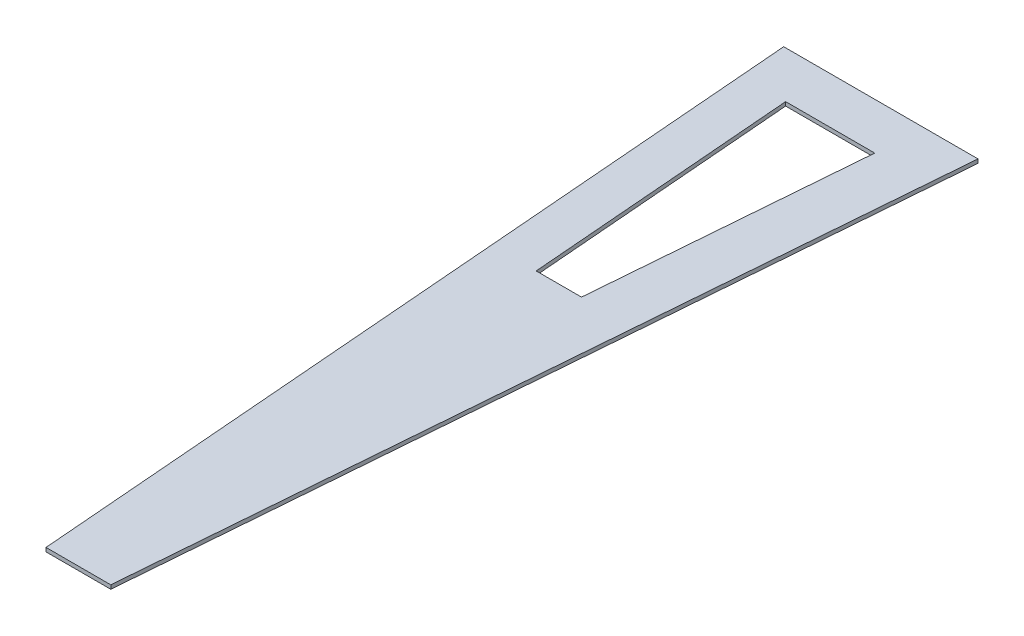
ISO-10303-21;
HEADER;
FILE_DESCRIPTION(('STEP AP214'),'2;1');
FILE_NAME('part.step','',(''),(''),'','','');
FILE_SCHEMA(('AUTOMOTIVE_DESIGN { 1 0 10303 214 1 1 1 1 }'));
ENDSEC;
DATA;
#1=APPLICATION_CONTEXT('core data for automotive mechanical design processes');
#2=APPLICATION_PROTOCOL_DEFINITION('international standard','automotive_design',2000,#1);
#3=PRODUCT_CONTEXT('',#1,'mechanical');
#4=PRODUCT('Part','Part','',(#3));
#5=PRODUCT_RELATED_PRODUCT_CATEGORY('part','',(#4));
#6=PRODUCT_DEFINITION_FORMATION('','',#4);
#7=PRODUCT_DEFINITION_CONTEXT('part definition',#1,'design');
#8=PRODUCT_DEFINITION('design','',#6,#7);
#9=PRODUCT_DEFINITION_SHAPE('','',#8);
#10=(LENGTH_UNIT() NAMED_UNIT(*) SI_UNIT(.MILLI.,.METRE.));
#11=(NAMED_UNIT(*) PLANE_ANGLE_UNIT() SI_UNIT($,.RADIAN.));
#12=(NAMED_UNIT(*) SI_UNIT($,.STERADIAN.) SOLID_ANGLE_UNIT());
#13=UNCERTAINTY_MEASURE_WITH_UNIT(LENGTH_MEASURE(1.E-05),#10,'distance_accuracy_value','');
#14=(GEOMETRIC_REPRESENTATION_CONTEXT(3) GLOBAL_UNCERTAINTY_ASSIGNED_CONTEXT((#13)) GLOBAL_UNIT_ASSIGNED_CONTEXT((#10,
#11,#12)) REPRESENTATION_CONTEXT('',''));
#15=CARTESIAN_POINT('',(0.,0.,0.));
#16=DIRECTION('',(0.,0.,1.));
#17=DIRECTION('',(1.,0.,0.));
#18=AXIS2_PLACEMENT_3D('',#15,#16,#17);
#19=CARTESIAN_POINT('',(0.,1.524,0.));
#20=DIRECTION('',(0.,-1.,0.));
#21=DIRECTION('',(0.,0.,-1.));
#22=AXIS2_PLACEMENT_3D('',#19,#20,#21);
#23=PLANE('',#22);
#24=DIRECTION('',(0.0804486484780702,0.,0.996758754643295));
#25=VECTOR('',#24,1.);
#26=CARTESIAN_POINT('',(25.3999999999999,1.524,314.706));
#27=LINE('',#26,#25);
#28=CARTESIAN_POINT('',(0.,1.524,0.));
#29=VERTEX_POINT('',#28);
#30=CARTESIAN_POINT('',(25.3999999999999,1.524,314.706));
#31=VERTEX_POINT('',#30);
#32=EDGE_CURVE('E136',#29,#31,#27,.T.);
#33=ORIENTED_EDGE('',*,*,#32,.T.);
#34=DIRECTION('',(1.,0.,0.));
#35=VECTOR('',#34,1.);
#36=CARTESIAN_POINT('',(50.7999999999999,1.524,314.706));
#37=LINE('',#36,#35);
#38=CARTESIAN_POINT('',(50.7999999999999,1.524,314.706));
#39=VERTEX_POINT('',#38);
#40=EDGE_CURVE('E139',#31,#39,#37,.T.);
#41=ORIENTED_EDGE('',*,*,#40,.T.);
#42=DIRECTION('',(0.080448648478071,0.,-0.996758754643295));
#43=VECTOR('',#42,1.);
#44=CARTESIAN_POINT('',(76.2,1.524,0.));
#45=LINE('',#44,#43);
#46=CARTESIAN_POINT('',(76.2,1.524,0.));
#47=VERTEX_POINT('',#46);
#48=EDGE_CURVE('E142',#39,#47,#45,.T.);
#49=ORIENTED_EDGE('',*,*,#48,.T.);
#50=DIRECTION('',(-1.,0.,0.));
#51=VECTOR('',#50,1.);
#52=CARTESIAN_POINT('',(0.,1.524,0.));
#53=LINE('',#52,#51);
#54=EDGE_CURVE('E144',#47,#29,#53,.T.);
#55=ORIENTED_EDGE('',*,*,#54,.T.);
#56=EDGE_LOOP('',(#33,#41,#49,#55));
#57=FACE_BOUND('',#56,.T.);
#58=DIRECTION('',(-1.,0.,0.));
#59=VECTOR('',#58,1.);
#60=CARTESIAN_POINT('',(53.982012586375,1.524,18.2672433250335));
#61=LINE('',#60,#59);
#62=CARTESIAN_POINT('',(53.982012586375,1.524,18.2672433250335));
#63=VERTEX_POINT('',#62);
#64=CARTESIAN_POINT('',(19.0232670932523,1.524,18.2672433250335));
#65=VERTEX_POINT('',#64);
#66=EDGE_CURVE('E100',#63,#65,#61,.T.);
#67=ORIENTED_EDGE('',*,*,#66,.F.);
#68=DIRECTION('',(0.080448648478071,0.,-0.996758754643295));
#69=VECTOR('',#68,1.);
#70=CARTESIAN_POINT('',(45.3926398398136,1.524,124.689571654929));
#71=LINE('',#70,#69);
#72=CARTESIAN_POINT('',(45.3926398398136,1.524,124.689571654929));
#73=VERTEX_POINT('',#72);
#74=EDGE_CURVE('E122',#73,#63,#71,.T.);
#75=ORIENTED_EDGE('',*,*,#74,.F.);
#76=DIRECTION('',(1.,0.,0.));
#77=VECTOR('',#76,1.);
#78=CARTESIAN_POINT('',(27.6126398398136,1.524,124.689571654929));
#79=LINE('',#78,#77);
#80=CARTESIAN_POINT('',(27.6126398398136,1.524,124.689571654929));
#81=VERTEX_POINT('',#80);
#82=EDGE_CURVE('E120',#81,#73,#79,.T.);
#83=ORIENTED_EDGE('',*,*,#82,.F.);
#84=DIRECTION('',(0.0804486484780702,0.,0.996758754643295));
#85=VECTOR('',#84,1.);
#86=CARTESIAN_POINT('',(19.0232670932523,1.524,18.2672433250335));
#87=LINE('',#86,#85);
#88=EDGE_CURVE('E108',#65,#81,#87,.T.);
#89=ORIENTED_EDGE('',*,*,#88,.F.);
#90=EDGE_LOOP('',(#67,#75,#83,#89));
#91=FACE_BOUND('',#90,.T.);
#92=ADVANCED_FACE('F35',(#57,#91),#23,.F.);
#93=CARTESIAN_POINT('',(0.,0.,0.));
#94=DIRECTION('',(0.,-1.,0.));
#95=DIRECTION('',(0.,0.,-1.));
#96=AXIS2_PLACEMENT_3D('',#93,#94,#95);
#97=PLANE('',#96);
#98=DIRECTION('',(0.0804486484780702,0.,0.996758754643295));
#99=VECTOR('',#98,1.);
#100=CARTESIAN_POINT('',(25.3999999999999,0.,314.706));
#101=LINE('',#100,#99);
#102=CARTESIAN_POINT('',(0.,0.,0.));
#103=VERTEX_POINT('',#102);
#104=CARTESIAN_POINT('',(25.3999999999999,0.,314.706));
#105=VERTEX_POINT('',#104);
#106=EDGE_CURVE('E116',#103,#105,#101,.T.);
#107=ORIENTED_EDGE('',*,*,#106,.F.);
#108=DIRECTION('',(-1.,0.,0.));
#109=VECTOR('',#108,1.);
#110=CARTESIAN_POINT('',(0.,0.,0.));
#111=LINE('',#110,#109);
#112=CARTESIAN_POINT('',(76.2,0.,0.));
#113=VERTEX_POINT('',#112);
#114=EDGE_CURVE('E140',#113,#103,#111,.T.);
#115=ORIENTED_EDGE('',*,*,#114,.F.);
#116=DIRECTION('',(0.080448648478071,0.,-0.996758754643295));
#117=VECTOR('',#116,1.);
#118=CARTESIAN_POINT('',(76.2,0.,0.));
#119=LINE('',#118,#117);
#120=CARTESIAN_POINT('',(50.7999999999999,0.,314.706));
#121=VERTEX_POINT('',#120);
#122=EDGE_CURVE('E151',#121,#113,#119,.T.);
#123=ORIENTED_EDGE('',*,*,#122,.F.);
#124=DIRECTION('',(1.,0.,0.));
#125=VECTOR('',#124,1.);
#126=CARTESIAN_POINT('',(50.7999999999999,0.,314.706));
#127=LINE('',#126,#125);
#128=EDGE_CURVE('E149',#105,#121,#127,.T.);
#129=ORIENTED_EDGE('',*,*,#128,.F.);
#130=EDGE_LOOP('',(#107,#115,#123,#129));
#131=FACE_BOUND('',#130,.T.);
#132=DIRECTION('',(0.080448648478071,0.,-0.996758754643295));
#133=VECTOR('',#132,1.);
#134=CARTESIAN_POINT('',(45.3926398398136,0.,124.689571654929));
#135=LINE('',#134,#133);
#136=CARTESIAN_POINT('',(45.3926398398136,0.,124.689571654929));
#137=VERTEX_POINT('',#136);
#138=CARTESIAN_POINT('',(53.982012586375,0.,18.2672433250335));
#139=VERTEX_POINT('',#138);
#140=EDGE_CURVE('E109',#137,#139,#135,.T.);
#141=ORIENTED_EDGE('',*,*,#140,.T.);
#142=DIRECTION('',(-1.,0.,0.));
#143=VECTOR('',#142,1.);
#144=CARTESIAN_POINT('',(53.982012586375,0.,18.2672433250335));
#145=LINE('',#144,#143);
#146=CARTESIAN_POINT('',(19.0232670932523,0.,18.2672433250335));
#147=VERTEX_POINT('',#146);
#148=EDGE_CURVE('E58',#139,#147,#145,.T.);
#149=ORIENTED_EDGE('',*,*,#148,.T.);
#150=DIRECTION('',(0.0804486484780702,0.,0.996758754643295));
#151=VECTOR('',#150,1.);
#152=CARTESIAN_POINT('',(19.0232670932523,0.,18.2672433250335));
#153=LINE('',#152,#151);
#154=CARTESIAN_POINT('',(27.6126398398136,0.,124.689571654929));
#155=VERTEX_POINT('',#154);
#156=EDGE_CURVE('E115',#147,#155,#153,.T.);
#157=ORIENTED_EDGE('',*,*,#156,.T.);
#158=DIRECTION('',(1.,0.,0.));
#159=VECTOR('',#158,1.);
#160=CARTESIAN_POINT('',(27.6126398398136,0.,124.689571654929));
#161=LINE('',#160,#159);
#162=EDGE_CURVE('E128',#155,#137,#161,.T.);
#163=ORIENTED_EDGE('',*,*,#162,.T.);
#164=EDGE_LOOP('',(#141,#149,#157,#163));
#165=FACE_BOUND('',#164,.T.);
#166=ADVANCED_FACE('F169',(#131,#165),#97,.T.);
#167=CARTESIAN_POINT('',(25.3999999999999,1.524,314.706));
#168=DIRECTION('',(0.996758754643295,0.,-0.0804486484780702));
#169=DIRECTION('',(-0.0804486484780702,0.,-0.996758754643295));
#170=AXIS2_PLACEMENT_3D('',#167,#168,#169);
#171=PLANE('',#170);
#172=ORIENTED_EDGE('',*,*,#106,.T.);
#173=DIRECTION('',(0.,-1.,0.));
#174=VECTOR('',#173,1.);
#175=CARTESIAN_POINT('',(25.3999999999999,1.524,314.706));
#176=LINE('',#175,#174);
#177=EDGE_CURVE('E11',#31,#105,#176,.T.);
#178=ORIENTED_EDGE('',*,*,#177,.F.);
#179=ORIENTED_EDGE('',*,*,#32,.F.);
#180=DIRECTION('',(0.,-1.,0.));
#181=VECTOR('',#180,1.);
#182=CARTESIAN_POINT('',(0.,1.524,0.));
#183=LINE('',#182,#181);
#184=EDGE_CURVE('E146',#29,#103,#183,.T.);
#185=ORIENTED_EDGE('',*,*,#184,.T.);
#186=EDGE_LOOP('',(#172,#178,#179,#185));
#187=FACE_BOUND('',#186,.T.);
#188=ADVANCED_FACE('F37',(#187),#171,.F.);
#189=CARTESIAN_POINT('',(50.7999999999999,1.524,314.706));
#190=DIRECTION('',(0.,0.,-1.));
#191=DIRECTION('',(-1.,0.,0.));
#192=AXIS2_PLACEMENT_3D('',#189,#190,#191);
#193=PLANE('',#192);
#194=ORIENTED_EDGE('',*,*,#128,.T.);
#195=DIRECTION('',(0.,-1.,0.));
#196=VECTOR('',#195,1.);
#197=CARTESIAN_POINT('',(50.7999999999999,1.524,314.706));
#198=LINE('',#197,#196);
#199=EDGE_CURVE('E43',#39,#121,#198,.T.);
#200=ORIENTED_EDGE('',*,*,#199,.F.);
#201=ORIENTED_EDGE('',*,*,#40,.F.);
#202=ORIENTED_EDGE('',*,*,#177,.T.);
#203=EDGE_LOOP('',(#194,#200,#201,#202));
#204=FACE_BOUND('',#203,.T.);
#205=ADVANCED_FACE('F179',(#204),#193,.F.);
#206=CARTESIAN_POINT('',(76.2,1.524,0.));
#207=DIRECTION('',(-0.996758754643295,0.,-0.080448648478071));
#208=DIRECTION('',(-0.080448648478071,0.,0.996758754643295));
#209=AXIS2_PLACEMENT_3D('',#206,#207,#208);
#210=PLANE('',#209);
#211=ORIENTED_EDGE('',*,*,#122,.T.);
#212=DIRECTION('',(0.,-1.,0.));
#213=VECTOR('',#212,1.);
#214=CARTESIAN_POINT('',(76.2,1.524,0.));
#215=LINE('',#214,#213);
#216=EDGE_CURVE('E156',#47,#113,#215,.T.);
#217=ORIENTED_EDGE('',*,*,#216,.F.);
#218=ORIENTED_EDGE('',*,*,#48,.F.);
#219=ORIENTED_EDGE('',*,*,#199,.T.);
#220=EDGE_LOOP('',(#211,#217,#218,#219));
#221=FACE_BOUND('',#220,.T.);
#222=ADVANCED_FACE('F163',(#221),#210,.F.);
#223=CARTESIAN_POINT('',(0.,1.524,0.));
#224=DIRECTION('',(0.,0.,1.));
#225=DIRECTION('',(1.,0.,0.));
#226=AXIS2_PLACEMENT_3D('',#223,#224,#225);
#227=PLANE('',#226);
#228=ORIENTED_EDGE('',*,*,#114,.T.);
#229=ORIENTED_EDGE('',*,*,#184,.F.);
#230=ORIENTED_EDGE('',*,*,#54,.F.);
#231=ORIENTED_EDGE('',*,*,#216,.T.);
#232=EDGE_LOOP('',(#228,#229,#230,#231));
#233=FACE_BOUND('',#232,.T.);
#234=ADVANCED_FACE('F173',(#233),#227,.F.);
#235=CARTESIAN_POINT('',(53.982012586375,1.524,18.2672433250335));
#236=DIRECTION('',(0.,0.,1.));
#237=DIRECTION('',(1.,0.,0.));
#238=AXIS2_PLACEMENT_3D('',#235,#236,#237);
#239=PLANE('',#238);
#240=ORIENTED_EDGE('',*,*,#148,.F.);
#241=DIRECTION('',(0.,-1.,0.));
#242=VECTOR('',#241,1.);
#243=CARTESIAN_POINT('',(53.982012586375,1.524,18.2672433250335));
#244=LINE('',#243,#242);
#245=EDGE_CURVE('E104',#63,#139,#244,.T.);
#246=ORIENTED_EDGE('',*,*,#245,.F.);
#247=ORIENTED_EDGE('',*,*,#66,.T.);
#248=DIRECTION('',(0.,-1.,0.));
#249=VECTOR('',#248,1.);
#250=CARTESIAN_POINT('',(19.0232670932523,1.524,18.2672433250335));
#251=LINE('',#250,#249);
#252=EDGE_CURVE('E103',#65,#147,#251,.T.);
#253=ORIENTED_EDGE('',*,*,#252,.T.);
#254=EDGE_LOOP('',(#240,#246,#247,#253));
#255=FACE_BOUND('',#254,.T.);
#256=ADVANCED_FACE('F102',(#255),#239,.T.);
#257=CARTESIAN_POINT('',(19.0232670932523,1.524,18.2672433250335));
#258=DIRECTION('',(0.996758754643295,0.,-0.0804486484780702));
#259=DIRECTION('',(-0.0804486484780702,0.,-0.996758754643295));
#260=AXIS2_PLACEMENT_3D('',#257,#258,#259);
#261=PLANE('',#260);
#262=ORIENTED_EDGE('',*,*,#156,.F.);
#263=ORIENTED_EDGE('',*,*,#252,.F.);
#264=ORIENTED_EDGE('',*,*,#88,.T.);
#265=DIRECTION('',(0.,-1.,0.));
#266=VECTOR('',#265,1.);
#267=CARTESIAN_POINT('',(27.6126398398136,1.524,124.689571654929));
#268=LINE('',#267,#266);
#269=EDGE_CURVE('E117',#81,#155,#268,.T.);
#270=ORIENTED_EDGE('',*,*,#269,.T.);
#271=EDGE_LOOP('',(#262,#263,#264,#270));
#272=FACE_BOUND('',#271,.T.);
#273=ADVANCED_FACE('F112',(#272),#261,.T.);
#274=CARTESIAN_POINT('',(27.6126398398136,1.524,124.689571654929));
#275=DIRECTION('',(0.,0.,-1.));
#276=DIRECTION('',(-1.,0.,0.));
#277=AXIS2_PLACEMENT_3D('',#274,#275,#276);
#278=PLANE('',#277);
#279=ORIENTED_EDGE('',*,*,#162,.F.);
#280=ORIENTED_EDGE('',*,*,#269,.F.);
#281=ORIENTED_EDGE('',*,*,#82,.T.);
#282=DIRECTION('',(0.,-1.,0.));
#283=VECTOR('',#282,1.);
#284=CARTESIAN_POINT('',(45.3926398398136,1.524,124.689571654929));
#285=LINE('',#284,#283);
#286=EDGE_CURVE('E50',#73,#137,#285,.T.);
#287=ORIENTED_EDGE('',*,*,#286,.T.);
#288=EDGE_LOOP('',(#279,#280,#281,#287));
#289=FACE_BOUND('',#288,.T.);
#290=ADVANCED_FACE('F202',(#289),#278,.T.);
#291=CARTESIAN_POINT('',(45.3926398398136,1.524,124.689571654929));
#292=DIRECTION('',(-0.996758754643295,0.,-0.080448648478071));
#293=DIRECTION('',(-0.080448648478071,0.,0.996758754643295));
#294=AXIS2_PLACEMENT_3D('',#291,#292,#293);
#295=PLANE('',#294);
#296=ORIENTED_EDGE('',*,*,#140,.F.);
#297=ORIENTED_EDGE('',*,*,#286,.F.);
#298=ORIENTED_EDGE('',*,*,#74,.T.);
#299=ORIENTED_EDGE('',*,*,#245,.T.);
#300=EDGE_LOOP('',(#296,#297,#298,#299));
#301=FACE_BOUND('',#300,.T.);
#302=ADVANCED_FACE('F206',(#301),#295,.T.);
#303=CLOSED_SHELL('',(#92,#166,#188,#205,#222,#234,#256,#273,#290,#302));
#304=MANIFOLD_SOLID_BREP('B2',#303);
#305=ADVANCED_BREP_SHAPE_REPRESENTATION('',(#18,#304),#14);
#306=SHAPE_DEFINITION_REPRESENTATION(#9,#305);
ENDSEC;
END-ISO-10303-21;
